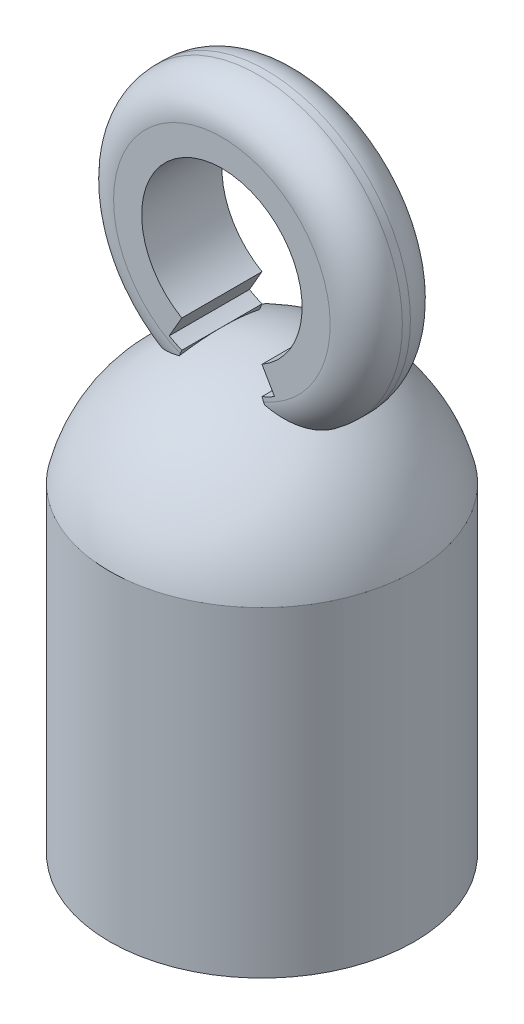
ISO-10303-21;
HEADER;
FILE_DESCRIPTION(('STEP AP214'),'2;1');
FILE_NAME('part.step','',(''),(''),'','','');
FILE_SCHEMA(('AUTOMOTIVE_DESIGN { 1 0 10303 214 1 1 1 1 }'));
ENDSEC;
DATA;
#1=APPLICATION_CONTEXT('core data for automotive mechanical design processes');
#2=APPLICATION_PROTOCOL_DEFINITION('international standard','automotive_design',2000,#1);
#3=PRODUCT_CONTEXT('',#1,'mechanical');
#4=PRODUCT('Part','Part','',(#3));
#5=PRODUCT_RELATED_PRODUCT_CATEGORY('part','',(#4));
#6=PRODUCT_DEFINITION_FORMATION('','',#4);
#7=PRODUCT_DEFINITION_CONTEXT('part definition',#1,'design');
#8=PRODUCT_DEFINITION('design','',#6,#7);
#9=PRODUCT_DEFINITION_SHAPE('','',#8);
#10=(LENGTH_UNIT() NAMED_UNIT(*) SI_UNIT(.MILLI.,.METRE.));
#11=(NAMED_UNIT(*) PLANE_ANGLE_UNIT() SI_UNIT($,.RADIAN.));
#12=(NAMED_UNIT(*) SI_UNIT($,.STERADIAN.) SOLID_ANGLE_UNIT());
#13=UNCERTAINTY_MEASURE_WITH_UNIT(LENGTH_MEASURE(1.E-05),#10,'distance_accuracy_value','');
#14=(GEOMETRIC_REPRESENTATION_CONTEXT(3) GLOBAL_UNCERTAINTY_ASSIGNED_CONTEXT((#13)) GLOBAL_UNIT_ASSIGNED_CONTEXT((#10,
#11,#12)) REPRESENTATION_CONTEXT('',''));
#15=CARTESIAN_POINT('',(0.,0.,0.));
#16=DIRECTION('',(0.,0.,1.));
#17=DIRECTION('',(1.,0.,0.));
#18=AXIS2_PLACEMENT_3D('',#15,#16,#17);
#19=CARTESIAN_POINT('',(0.,80.,0.));
#20=DIRECTION('',(0.,-1.,0.));
#21=DIRECTION('',(0.,0.,-1.));
#22=AXIS2_PLACEMENT_3D('',#19,#20,#21);
#23=CYLINDRICAL_SURFACE('',#22,38.);
#24=CARTESIAN_POINT('',(0.,80.,0.));
#25=DIRECTION('',(0.,1.,0.));
#26=DIRECTION('',(0.,0.,1.));
#27=AXIS2_PLACEMENT_3D('',#24,#25,#26);
#28=CIRCLE('',#27,38.);
#29=CARTESIAN_POINT('',(0.,80.,38.));
#30=VERTEX_POINT('',#29);
#31=EDGE_CURVE('E258',#30,#30,#28,.T.);
#32=ORIENTED_EDGE('',*,*,#31,.F.);
#33=EDGE_LOOP('',(#32));
#34=FACE_BOUND('',#33,.T.);
#35=CARTESIAN_POINT('',(0.,0.,0.));
#36=DIRECTION('',(0.,1.,0.));
#37=DIRECTION('',(0.,0.,1.));
#38=AXIS2_PLACEMENT_3D('',#35,#36,#37);
#39=CIRCLE('',#38,38.);
#40=CARTESIAN_POINT('',(0.,0.,38.));
#41=VERTEX_POINT('',#40);
#42=EDGE_CURVE('E253',#41,#41,#39,.T.);
#43=ORIENTED_EDGE('',*,*,#42,.T.);
#44=EDGE_LOOP('',(#43));
#45=FACE_BOUND('',#44,.T.);
#46=ADVANCED_FACE('F83',(#34,#45),#23,.T.);
#47=CARTESIAN_POINT('',(0.,70.9333333333333,0.));
#48=DIRECTION('',(0.,0.,1.));
#49=DIRECTION('',(1.,0.,0.));
#50=AXIS2_PLACEMENT_3D('',#47,#48,#49);
#51=SPHERICAL_SURFACE('',#50,39.0666666666667);
#52=CARTESIAN_POINT('',(-21.9284457028927,80.0701857095387,0.));
#53=DIRECTION('',(0.923076923076923,-0.384615384615386,0.));
#54=DIRECTION('',(0.384615384615386,0.923076923076923,0.));
#55=AXIS2_PLACEMENT_3D('',#52,#53,#54);
#56=CIRCLE('',#55,31.0139588275209);
#57=CARTESIAN_POINT('',(-10.6340204933393,107.176806212467,9.97660895551203));
#58=VERTEX_POINT('',#57);
#59=CARTESIAN_POINT('',(-10.0000000000001,108.698455396481,0.));
#60=VERTEX_POINT('',#59);
#61=EDGE_CURVE('E294',#58,#60,#56,.F.);
#62=ORIENTED_EDGE('',*,*,#61,.F.);
#63=CARTESIAN_POINT('',(-10.6340204933393,107.176806212467,9.97660895551203));
#64=CARTESIAN_POINT('',(-10.9967862438685,107.075012641399,9.95977995552082));
#65=CARTESIAN_POINT('',(-11.3584890454471,106.970301555475,9.93320798637625));
#66=CARTESIAN_POINT('',(-12.0788179585802,106.756238149302,9.85742275019991));
#67=CARTESIAN_POINT('',(-12.4374373106849,106.646877765958,9.80816856034925));
#68=CARTESIAN_POINT('',(-13.152519686238,106.424092353839,9.68334396158272));
#69=CARTESIAN_POINT('',(-13.5089344127348,106.310639640014,9.60754116374557));
#70=CARTESIAN_POINT('',(-14.2137051001449,106.082345913261,9.42693757116779));
#71=CARTESIAN_POINT('',(-14.5620665470673,105.96750593173,9.32215718731323));
#72=CARTESIAN_POINT('',(-15.1751061737104,105.762597520496,9.10676201848693));
#73=CARTESIAN_POINT('',(-15.4418520932187,105.672445000044,9.0021062056229));
#74=CARTESIAN_POINT('',(-15.9668300635496,105.493434524665,8.77235750580321));
#75=CARTESIAN_POINT('',(-16.2250637854138,105.404576317584,8.64726865914785));
#76=CARTESIAN_POINT('',(-16.7304268209875,105.229468396684,8.37627778965075));
#77=CARTESIAN_POINT('',(-16.9775823262028,105.143212707194,8.23042867866865));
#78=CARTESIAN_POINT('',(-17.4592547772297,104.974263137932,7.9172979284725));
#79=CARTESIAN_POINT('',(-17.6937719810923,104.891569185444,7.75001672709813));
#80=CARTESIAN_POINT('',(-18.1502449035558,104.730113555947,7.39204517791535));
#81=CARTESIAN_POINT('',(-18.3720341968576,104.651405098515,7.20111771262589));
#82=CARTESIAN_POINT('',(-18.7975070307496,104.50027398765,6.79781390634399));
#83=CARTESIAN_POINT('',(-19.0011937356424,104.427850235713,6.5854413278409));
#84=CARTESIAN_POINT('',(-19.3878046565745,104.29061601317,6.14010278056936));
#85=CARTESIAN_POINT('',(-19.57072050442,104.225808610686,5.90712857855121));
#86=CARTESIAN_POINT('',(-19.9128734382014,104.105201227879,5.42224359931389));
#87=CARTESIAN_POINT('',(-20.0721165447357,104.049398957006,5.17033766155278));
#88=CARTESIAN_POINT('',(-20.3429964096043,103.955440334521,4.6876781894133));
#89=CARTESIAN_POINT('',(-20.458188775218,103.915897737798,4.45918405249552));
#90=CARTESIAN_POINT('',(-20.667826588557,103.845015519018,3.99166823909234));
#91=CARTESIAN_POINT('',(-20.7622763136125,103.813674205523,3.75264874526298));
#92=CARTESIAN_POINT('',(-20.9289234317993,103.759855514248,3.26659548387099));
#93=CARTESIAN_POINT('',(-21.0011690678456,103.737358889433,3.01958039870203));
#94=CARTESIAN_POINT('',(-21.1225725212385,103.701616975258,2.519412187099));
#95=CARTESIAN_POINT('',(-21.1717455245238,103.68836559806,2.26626321359437));
#96=CARTESIAN_POINT('',(-21.233502983989,103.674319007151,1.84373814447544));
#97=CARTESIAN_POINT('',(-21.2528520820735,103.670810429103,1.67540831317319));
#98=CARTESIAN_POINT('',(-21.2811430802452,103.66795617748,1.33808845793413));
#99=CARTESIAN_POINT('',(-21.2901000708777,103.668604458704,1.16909974971796));
#100=CARTESIAN_POINT('',(-21.2938240823766,103.671346412829,1.));
#101=B_SPLINE_CURVE_WITH_KNOTS('',3,(#63,#64,#65,#66,#67,#68,#69,#70,#71,#72,#73,#74,#75,#76,
#77,#78,#79,#80,#81,#82,#83,#84,#85,#86,#87,#88,#89,#90,#91,#92,#93,#94,#95,#96,#97,#98,#99,
#100),.UNSPECIFIED.,.F.,.F.,(4,2,2,2,2,2,2,2,2,2,2,2,2,2,2,2,2,2,4),(0.,1.13162243665539,
2.26529457167079,3.4091489168924,4.55219961073826,5.45263194193229,6.35288644231638,
7.25088622853303,8.14886767228946,9.05672044431406,9.96441421176617,10.8724723844184,
11.7802992175243,12.5559648518875,13.3314703861035,14.1052788664847,14.8785773249185,
15.3866547351806,15.8939934310404),.UNSPECIFIED.);
#102=CARTESIAN_POINT('',(-21.2938240823766,103.671346412829,1.));
#103=VERTEX_POINT('',#102);
#104=EDGE_CURVE('E97',#58,#103,#101,.T.);
#105=ORIENTED_EDGE('',*,*,#104,.T.);
#106=CARTESIAN_POINT('',(-20.1558115123329,102.869890860464,10.0002));
#107=CARTESIAN_POINT('',(-20.2736400368171,102.949535847892,9.50838394796362));
#108=CARTESIAN_POINT('',(-20.3820436538494,103.023778884588,9.01345035291414));
#109=CARTESIAN_POINT('',(-20.5803739732907,103.160968106451,8.01836292092795));
#110=CARTESIAN_POINT('',(-20.6703014492672,103.223914764566,7.51820930346723));
#111=CARTESIAN_POINT('',(-20.832064869141,103.338026920175,6.51363868919631));
#112=CARTESIAN_POINT('',(-20.9039002141762,103.389192027686,6.00922155183165));
#113=CARTESIAN_POINT('',(-21.0297668744923,103.479370381805,4.99708991593238));
#114=CARTESIAN_POINT('',(-21.0837981268089,103.518383585438,4.48937540574305));
#115=CARTESIAN_POINT('',(-21.1732500136537,103.583228215046,3.48318563403566));
#116=CARTESIAN_POINT('',(-21.2090667573398,103.609339816428,2.98476354001172));
#117=CARTESIAN_POINT('',(-21.2640562168268,103.649512659959,1.98651774628175));
#118=CARTESIAN_POINT('',(-21.2832289077791,103.663573884119,1.48669404448432));
#119=CARTESIAN_POINT('',(-21.3050048895635,103.679548556826,0.486592314367823));
#120=CARTESIAN_POINT('',(-21.3076115915717,103.681464506261,-0.013685599201563));
#121=CARTESIAN_POINT('',(-21.2962757298195,103.673144599838,-1.01391253847238));
#122=CARTESIAN_POINT('',(-21.2823341135052,103.662909439671,-1.51386158136309));
#123=CARTESIAN_POINT('',(-21.2302373083216,103.624781615842,-2.68349994394809));
#124=CARTESIAN_POINT('',(-21.1854307928935,103.592046540089,-3.35275322548209));
#125=CARTESIAN_POINT('',(-21.0656102724274,103.505211347234,-4.68697784381051));
#126=CARTESIAN_POINT('',(-20.990603016039,103.451116003344,-5.35195010353498));
#127=CARTESIAN_POINT('',(-20.8084229624575,103.321214350187,-6.68607851759129));
#128=CARTESIAN_POINT('',(-20.7007660472081,103.245082118821,-7.35513778544349));
#129=CARTESIAN_POINT('',(-20.5149082425511,103.11561941296,-8.3522289964569));
#130=CARTESIAN_POINT('',(-20.4488776588868,103.069910267777,-8.6835765148358));
#131=CARTESIAN_POINT('',(-20.3085650110439,102.973560296285,-9.34380505606331));
#132=CARTESIAN_POINT('',(-20.2342827760118,102.922919367863,-9.67268602769062));
#133=CARTESIAN_POINT('',(-20.1558115123331,102.869890860464,-10.0002));
#134=B_SPLINE_CURVE_WITH_KNOTS('',3,(#106,#107,#108,#109,#110,#111,#112,#113,#114,#115,#116,
#117,#118,#119,#120,#121,#122,#123,#124,#125,#126,#127,#128,#129,#130,#131,#132,#133),
.UNSPECIFIED.,.F.,.F.,(4,2,2,2,2,2,2,2,2,2,2,2,2,4),(0.,1.53575441774131,3.07144452270467,
4.60718545341252,6.14293181522776,7.64367507920428,9.14442058369331,10.6448570530221,
12.1452076215383,14.1587754004143,16.1718934774647,18.2164559802332,19.2391533190631,
20.2618718371557),.UNSPECIFIED.);
#135=CARTESIAN_POINT('',(-21.2938240823766,103.671346412829,-0.999999999999999));
#136=VERTEX_POINT('',#135);
#137=EDGE_CURVE('E287',#103,#136,#134,.T.);
#138=ORIENTED_EDGE('',*,*,#137,.T.);
#139=CARTESIAN_POINT('',(-21.2938240823766,103.671346412829,-1.));
#140=CARTESIAN_POINT('',(-21.2889047706708,103.667691832027,-1.22459970082557));
#141=CARTESIAN_POINT('',(-21.2747089921182,103.667750747968,-1.44903687770988));
#142=CARTESIAN_POINT('',(-21.2281261942383,103.675161074152,-1.89582479452898));
#143=CARTESIAN_POINT('',(-21.1957449566272,103.682510167194,-2.11817617477054));
#144=CARTESIAN_POINT('',(-21.1133197871765,103.704319101359,-2.55826600945968));
#145=CARTESIAN_POINT('',(-21.0633492990044,103.718749471971,-2.77601971405687));
#146=CARTESIAN_POINT('',(-20.9463117040777,103.754455640125,-3.20631038714987));
#147=CARTESIAN_POINT('',(-20.8792438772838,103.775731725978,-3.41884713552475));
#148=CARTESIAN_POINT('',(-20.7288360197442,103.824774150702,-3.83703653388076));
#149=CARTESIAN_POINT('',(-20.6455137223876,103.852533422963,-4.04269640255052));
#150=CARTESIAN_POINT('',(-20.463389922132,103.91416824561,-4.44619078532828));
#151=CARTESIAN_POINT('',(-20.3645816544429,103.94804646995,-4.64402183201753));
#152=CARTESIAN_POINT('',(-20.1524450519681,104.021472049956,-5.03075473031557));
#153=CARTESIAN_POINT('',(-20.0391096773445,104.061022155329,-5.21965219154649));
#154=CARTESIAN_POINT('',(-19.7990091673571,104.145281324082,-5.58750526354216));
#155=CARTESIAN_POINT('',(-19.6722428226264,104.189990852065,-5.76645997681528));
#156=CARTESIAN_POINT('',(-19.4001219726176,104.286255191557,-6.12185921529104));
#157=CARTESIAN_POINT('',(-19.2541728829761,104.338033351421,-6.29778763538573));
#158=CARTESIAN_POINT('',(-18.9500634215793,104.446034008373,-6.63726515311431));
#159=CARTESIAN_POINT('',(-18.7919029681685,104.502256535179,-6.80081416795464));
#160=CARTESIAN_POINT('',(-18.4647048512664,104.618493894288,-7.11504617301188));
#161=CARTESIAN_POINT('',(-18.2956708905531,104.678507435505,-7.26573350279692));
#162=CARTESIAN_POINT('',(-17.9479094413458,104.801722670225,-7.55407424181917));
#163=CARTESIAN_POINT('',(-17.7691801944761,104.864924941903,-7.69172527422745));
#164=CARTESIAN_POINT('',(-17.3318950994583,105.019044988795,-8.00499554683038));
#165=CARTESIAN_POINT('',(-17.0693698151592,105.111166634404,-8.17451104429511));
#166=CARTESIAN_POINT('',(-16.5308628313434,105.298826602881,-8.48845767596165));
#167=CARTESIAN_POINT('',(-16.2548765693244,105.394366081231,-8.63288022834921));
#168=CARTESIAN_POINT('',(-15.6911315995032,105.587741882267,-8.89783896943634));
#169=CARTESIAN_POINT('',(-15.4033333210024,105.685585361151,-9.01828533733228));
#170=CARTESIAN_POINT('',(-14.8192298392296,105.881895022157,-9.23578327937108));
#171=CARTESIAN_POINT('',(-14.5229231775361,105.980361308751,-9.33283081560812));
#172=CARTESIAN_POINT('',(-13.9314151412388,106.174200019225,-9.50278280048595));
#173=CARTESIAN_POINT('',(-13.6363747608992,106.269587786252,-9.57623497259377));
#174=CARTESIAN_POINT('',(-13.0416057919008,106.458786870901,-9.70384469759392));
#175=CARTESIAN_POINT('',(-12.7418760864866,106.552597801618,-9.75799757906593));
#176=CARTESIAN_POINT('',(-12.1419829656353,106.736794886702,-9.84826554893291));
#177=CARTESIAN_POINT('',(-11.8418522440958,106.82720550766,-9.88455128261057));
#178=CARTESIAN_POINT('',(-11.2394148013789,107.004685303199,-9.94167889968597));
#179=CARTESIAN_POINT('',(-10.937110207954,107.091757325211,-9.96253423430179));
#180=CARTESIAN_POINT('',(-10.6340204933393,107.176806212467,-9.97660895551203));
#181=B_SPLINE_CURVE_WITH_KNOTS('',3,(#139,#140,#141,#142,#143,#144,#145,#146,#147,#148,#149,
#150,#151,#152,#153,#154,#155,#156,#157,#158,#159,#160,#161,#162,#163,#164,#165,#166,#167,#168,
#169,#170,#171,#172,#173,#174,#175,#176,#177,#178,#179,#180),.UNSPECIFIED.,.F.,.F.,(4,2,2,2,2,2,
2,2,2,2,2,2,2,2,2,2,2,2,2,2,4),(0.,0.673802349464596,1.34739059763043,2.01819901445322,
2.68903568645439,3.35914453769739,4.02954693502443,4.7002754464699,5.37106440382869,
6.07347799776906,6.77589628904288,7.47807663778432,8.18038476532462,9.15633605381641,
10.1326204644946,11.1124961601096,12.0925408307594,13.0478401692839,14.0033705825535,
14.9495888107279,15.8949812124056),.UNSPECIFIED.);
#182=CARTESIAN_POINT('',(-10.6340204933393,107.176806212467,-9.97660895551203));
#183=VERTEX_POINT('',#182);
#184=EDGE_CURVE('E311',#136,#183,#181,.T.);
#185=ORIENTED_EDGE('',*,*,#184,.T.);
#186=EDGE_CURVE('E271',#60,#183,#56,.F.);
#187=ORIENTED_EDGE('',*,*,#186,.F.);
#188=EDGE_LOOP('',(#62,#105,#138,#185,#187));
#189=FACE_BOUND('',#188,.T.);
#190=CARTESIAN_POINT('',(21.9284457028927,80.0701857095386,0.));
#191=DIRECTION('',(-0.923076923076923,-0.384615384615385,0.));
#192=DIRECTION('',(0.384615384615385,-0.923076923076923,0.));
#193=AXIS2_PLACEMENT_3D('',#190,#191,#192);
#194=CIRCLE('',#193,31.0139588275209);
#195=CARTESIAN_POINT('',(10.,108.698455396481,0.));
#196=VERTEX_POINT('',#195);
#197=CARTESIAN_POINT('',(10.6340204933393,107.176806212467,9.97660895551204));
#198=VERTEX_POINT('',#197);
#199=EDGE_CURVE('E264',#196,#198,#194,.F.);
#200=ORIENTED_EDGE('',*,*,#199,.F.);
#201=CARTESIAN_POINT('',(10.6340204933393,107.176806212467,-9.97660895551205));
#202=VERTEX_POINT('',#201);
#203=EDGE_CURVE('E261',#202,#196,#194,.F.);
#204=ORIENTED_EDGE('',*,*,#203,.F.);
#205=CARTESIAN_POINT('',(10.6340204933393,107.176806212467,-9.97660895551205));
#206=CARTESIAN_POINT('',(10.9967862438684,107.075012641399,-9.95977995552082));
#207=CARTESIAN_POINT('',(11.3584890454471,106.970301555475,-9.93320798637625));
#208=CARTESIAN_POINT('',(12.0788179585801,106.756238149302,-9.85742275019991));
#209=CARTESIAN_POINT('',(12.4374373106849,106.646877765958,-9.80816856034926));
#210=CARTESIAN_POINT('',(13.152519686238,106.424092353839,-9.68334396158273));
#211=CARTESIAN_POINT('',(13.5089344127347,106.310639640014,-9.60754116374557));
#212=CARTESIAN_POINT('',(14.2137051001448,106.082345913261,-9.4269375711678));
#213=CARTESIAN_POINT('',(14.5620665470672,105.96750593173,-9.32215718731324));
#214=CARTESIAN_POINT('',(15.1751061737104,105.762597520496,-9.10676201848695));
#215=CARTESIAN_POINT('',(15.4418520932187,105.672445000044,-9.00210620562291));
#216=CARTESIAN_POINT('',(15.9668300635496,105.493434524665,-8.77235750580322));
#217=CARTESIAN_POINT('',(16.2250637854137,105.404576317584,-8.64726865914786));
#218=CARTESIAN_POINT('',(16.7304268209875,105.229468396684,-8.37627778965076));
#219=CARTESIAN_POINT('',(16.9775823262027,105.143212707194,-8.23042867866866));
#220=CARTESIAN_POINT('',(17.4592547772297,104.974263137932,-7.91729792847251));
#221=CARTESIAN_POINT('',(17.6937719810922,104.891569185444,-7.75001672709815));
#222=CARTESIAN_POINT('',(18.1502449035558,104.730113555947,-7.39204517791538));
#223=CARTESIAN_POINT('',(18.3720341968576,104.651405098515,-7.20111771262591));
#224=CARTESIAN_POINT('',(18.7975070307495,104.50027398765,-6.79781390634401));
#225=CARTESIAN_POINT('',(19.0011937356424,104.427850235713,-6.58544132784092));
#226=CARTESIAN_POINT('',(19.3878046565744,104.29061601317,-6.14010278056938));
#227=CARTESIAN_POINT('',(19.57072050442,104.225808610686,-5.90712857855123));
#228=CARTESIAN_POINT('',(19.9128734382014,104.105201227879,-5.42224359931391));
#229=CARTESIAN_POINT('',(20.0721165447357,104.049398957006,-5.1703376615528));
#230=CARTESIAN_POINT('',(20.3429964096042,103.955440334521,-4.68767818941332));
#231=CARTESIAN_POINT('',(20.458188775218,103.915897737798,-4.45918405249554));
#232=CARTESIAN_POINT('',(20.667826588557,103.845015519018,-3.99166823909236));
#233=CARTESIAN_POINT('',(20.7622763136125,103.813674205523,-3.752648745263));
#234=CARTESIAN_POINT('',(20.9289234317993,103.759855514248,-3.26659548387101));
#235=CARTESIAN_POINT('',(21.0011690678456,103.737358889433,-3.01958039870205));
#236=CARTESIAN_POINT('',(21.1225725212384,103.701616975258,-2.51941218709903));
#237=CARTESIAN_POINT('',(21.1717455245238,103.68836559806,-2.26626321359439));
#238=CARTESIAN_POINT('',(21.233502983989,103.674319007151,-1.84373814447546));
#239=CARTESIAN_POINT('',(21.2528520820735,103.670810429103,-1.67540831317321));
#240=CARTESIAN_POINT('',(21.2811430802451,103.66795617748,-1.33808845793413));
#241=CARTESIAN_POINT('',(21.2901000708777,103.668604458704,-1.16909974971796));
#242=CARTESIAN_POINT('',(21.2938240823766,103.671346412829,-1.));
#243=B_SPLINE_CURVE_WITH_KNOTS('',3,(#205,#206,#207,#208,#209,#210,#211,#212,#213,#214,#215,
#216,#217,#218,#219,#220,#221,#222,#223,#224,#225,#226,#227,#228,#229,#230,#231,#232,#233,#234,
#235,#236,#237,#238,#239,#240,#241,#242),.UNSPECIFIED.,.F.,.F.,(4,2,2,2,2,2,2,2,2,2,2,2,2,2,2,2,
2,2,4),(0.,1.13162243665539,2.26529457167079,3.4091489168924,4.55219961073825,5.45263194193228,
6.35288644231638,7.25088622853303,8.14886767228946,9.05672044431406,9.96441421176616,
10.8724723844184,11.7802992175243,12.5559648518875,13.3314703861035,14.1052788664847,
14.8785773249185,15.3866547351806,15.8939934310404),.UNSPECIFIED.);
#244=CARTESIAN_POINT('',(21.2938240823766,103.671346412829,-1.));
#245=VERTEX_POINT('',#244);
#246=EDGE_CURVE('E317',#202,#245,#243,.T.);
#247=ORIENTED_EDGE('',*,*,#246,.T.);
#248=CARTESIAN_POINT('',(20.1558115123329,102.869890860464,-10.0002));
#249=CARTESIAN_POINT('',(20.273640036817,102.949535847892,-9.50838394796362));
#250=CARTESIAN_POINT('',(20.3820436538494,103.023778884588,-9.01345035291414));
#251=CARTESIAN_POINT('',(20.5803739732907,103.160968106451,-8.01836292092795));
#252=CARTESIAN_POINT('',(20.6703014492671,103.223914764566,-7.51820930346723));
#253=CARTESIAN_POINT('',(20.832064869141,103.338026920175,-6.51363868919631));
#254=CARTESIAN_POINT('',(20.9039002141762,103.389192027686,-6.00922155183165));
#255=CARTESIAN_POINT('',(21.0297668744923,103.479370381805,-4.99708991593238));
#256=CARTESIAN_POINT('',(21.0837981268088,103.518383585438,-4.48937540574305));
#257=CARTESIAN_POINT('',(21.1732500136537,103.583228215046,-3.48318563403566));
#258=CARTESIAN_POINT('',(21.2090667573398,103.609339816428,-2.98476354001172));
#259=CARTESIAN_POINT('',(21.2640562168268,103.649512659959,-1.98651774628175));
#260=CARTESIAN_POINT('',(21.283228907779,103.663573884119,-1.48669404448433));
#261=CARTESIAN_POINT('',(21.3050048895635,103.679548556826,-0.486592314367824));
#262=CARTESIAN_POINT('',(21.3076115915717,103.681464506261,0.0136855992015615));
#263=CARTESIAN_POINT('',(21.2962757298195,103.673144599838,1.01391253847238));
#264=CARTESIAN_POINT('',(21.2823341135052,103.662909439671,1.51386158136309));
#265=CARTESIAN_POINT('',(21.2302373083216,103.624781615842,2.68349994394809));
#266=CARTESIAN_POINT('',(21.1854307928935,103.592046540089,3.35275322548209));
#267=CARTESIAN_POINT('',(21.0656102724274,103.505211347234,4.68697784381051));
#268=CARTESIAN_POINT('',(20.990603016039,103.451116003344,5.35195010353499));
#269=CARTESIAN_POINT('',(20.8084229624575,103.321214350187,6.68607851759129));
#270=CARTESIAN_POINT('',(20.7007660472081,103.245082118821,7.3551377854435));
#271=CARTESIAN_POINT('',(20.514908242551,103.11561941296,8.3522289964569));
#272=CARTESIAN_POINT('',(20.4488776588868,103.069910267777,8.6835765148358));
#273=CARTESIAN_POINT('',(20.3085650110438,102.973560296285,9.3438050560633));
#274=CARTESIAN_POINT('',(20.2342827760118,102.922919367864,9.67268602769062));
#275=CARTESIAN_POINT('',(20.155811512333,102.869890860464,10.0002));
#276=B_SPLINE_CURVE_WITH_KNOTS('',3,(#248,#249,#250,#251,#252,#253,#254,#255,#256,#257,#258,
#259,#260,#261,#262,#263,#264,#265,#266,#267,#268,#269,#270,#271,#272,#273,#274,#275),
.UNSPECIFIED.,.F.,.F.,(4,2,2,2,2,2,2,2,2,2,2,2,2,4),(0.,1.5357544177413,3.07144452270467,
4.60718545341253,6.14293181522776,7.64367507920428,9.14442058369331,10.6448570530221,
12.1452076215383,14.1587754004143,16.1718934774647,18.2164559802332,19.2391533190631,
20.2618718371557),.UNSPECIFIED.);
#277=CARTESIAN_POINT('',(21.2938240823766,103.671346412829,1.));
#278=VERTEX_POINT('',#277);
#279=EDGE_CURVE('E263',#245,#278,#276,.T.);
#280=ORIENTED_EDGE('',*,*,#279,.T.);
#281=CARTESIAN_POINT('',(21.2938240823766,103.671346412829,1.));
#282=CARTESIAN_POINT('',(21.2889047706708,103.667691832027,1.22459970082557));
#283=CARTESIAN_POINT('',(21.2747089921182,103.667750747968,1.44903687770988));
#284=CARTESIAN_POINT('',(21.2281261942382,103.675161074152,1.89582479452898));
#285=CARTESIAN_POINT('',(21.1957449566272,103.682510167194,2.11817617477054));
#286=CARTESIAN_POINT('',(21.1133197871765,103.704319101359,2.55826600945968));
#287=CARTESIAN_POINT('',(21.0633492990043,103.718749471971,2.77601971405687));
#288=CARTESIAN_POINT('',(20.9463117040777,103.754455640125,3.20631038714987));
#289=CARTESIAN_POINT('',(20.8792438772838,103.775731725978,3.41884713552475));
#290=CARTESIAN_POINT('',(20.7288360197442,103.824774150702,3.83703653388076));
#291=CARTESIAN_POINT('',(20.6455137223876,103.852533422963,4.04269640255052));
#292=CARTESIAN_POINT('',(20.463389922132,103.91416824561,4.44619078532828));
#293=CARTESIAN_POINT('',(20.3645816544428,103.94804646995,4.64402183201753));
#294=CARTESIAN_POINT('',(20.1524450519681,104.021472049956,5.03075473031556));
#295=CARTESIAN_POINT('',(20.0391096773445,104.061022155329,5.21965219154649));
#296=CARTESIAN_POINT('',(19.799009167357,104.145281324082,5.58750526354216));
#297=CARTESIAN_POINT('',(19.6722428226264,104.189990852065,5.76645997681528));
#298=CARTESIAN_POINT('',(19.4001219726176,104.286255191557,6.12185921529104));
#299=CARTESIAN_POINT('',(19.2541728829761,104.338033351421,6.29778763538573));
#300=CARTESIAN_POINT('',(18.9500634215793,104.446034008373,6.63726515311431));
#301=CARTESIAN_POINT('',(18.7919029681685,104.502256535179,6.80081416795463));
#302=CARTESIAN_POINT('',(18.4647048512664,104.618493894288,7.11504617301188));
#303=CARTESIAN_POINT('',(18.2956708905531,104.678507435505,7.26573350279692));
#304=CARTESIAN_POINT('',(17.9479094413458,104.801722670225,7.55407424181917));
#305=CARTESIAN_POINT('',(17.7691801944761,104.864924941903,7.69172527422745));
#306=CARTESIAN_POINT('',(17.3318950994582,105.019044988795,8.00499554683038));
#307=CARTESIAN_POINT('',(17.0693698151592,105.111166634404,8.17451104429511));
#308=CARTESIAN_POINT('',(16.5308628313434,105.298826602881,8.48845767596165));
#309=CARTESIAN_POINT('',(16.2548765693244,105.394366081231,8.63288022834921));
#310=CARTESIAN_POINT('',(15.6911315995032,105.587741882267,8.89783896943634));
#311=CARTESIAN_POINT('',(15.4033333210024,105.685585361152,9.01828533733228));
#312=CARTESIAN_POINT('',(14.8192298392296,105.881895022157,9.23578327937108));
#313=CARTESIAN_POINT('',(14.522923177536,105.980361308751,9.33283081560812));
#314=CARTESIAN_POINT('',(13.9314151412388,106.174200019225,9.50278280048595));
#315=CARTESIAN_POINT('',(13.6363747608992,106.269587786252,9.57623497259377));
#316=CARTESIAN_POINT('',(13.0416057919007,106.458786870901,9.70384469759393));
#317=CARTESIAN_POINT('',(12.7418760864866,106.552597801618,9.75799757906593));
#318=CARTESIAN_POINT('',(12.1419829656352,106.736794886702,9.84826554893291));
#319=CARTESIAN_POINT('',(11.8418522440958,106.82720550766,9.88455128261057));
#320=CARTESIAN_POINT('',(11.2394148013789,107.004685303199,9.94167889968597));
#321=CARTESIAN_POINT('',(10.9371102079539,107.091757325211,9.9625342343018));
#322=CARTESIAN_POINT('',(10.6340204933393,107.176806212467,9.97660895551203));
#323=B_SPLINE_CURVE_WITH_KNOTS('',3,(#281,#282,#283,#284,#285,#286,#287,#288,#289,#290,#291,
#292,#293,#294,#295,#296,#297,#298,#299,#300,#301,#302,#303,#304,#305,#306,#307,#308,#309,#310,
#311,#312,#313,#314,#315,#316,#317,#318,#319,#320,#321,#322),.UNSPECIFIED.,.F.,.F.,(4,2,2,2,2,2,
2,2,2,2,2,2,2,2,2,2,2,2,2,2,4),(0.,0.673802349464594,1.34739059763043,2.01819901445322,
2.68903568645439,3.35914453769739,4.02954693502442,4.70027544646989,5.37106440382869,
6.07347799776906,6.77589628904288,7.47807663778432,8.18038476532462,9.15633605381641,
10.1326204644946,11.1124961601096,12.0925408307594,13.0478401692839,14.0033705825535,
14.9495888107279,15.8949812124056),.UNSPECIFIED.);
#324=EDGE_CURVE('E12',#278,#198,#323,.T.);
#325=ORIENTED_EDGE('',*,*,#324,.T.);
#326=EDGE_LOOP('',(#200,#204,#247,#280,#325));
#327=FACE_BOUND('',#326,.T.);
#328=ORIENTED_EDGE('',*,*,#31,.T.);
#329=EDGE_LOOP('',(#328));
#330=FACE_BOUND('',#329,.T.);
#331=ADVANCED_FACE('F273',(#189,#327,#330),#51,.T.);
#332=CARTESIAN_POINT('',(0.,0.,0.));
#333=DIRECTION('',(0.,1.,0.));
#334=DIRECTION('',(0.,0.,1.));
#335=AXIS2_PLACEMENT_3D('',#332,#333,#334);
#336=PLANE('',#335);
#337=CARTESIAN_POINT('',(0.,0.,0.));
#338=DIRECTION('',(0.,-1.,0.));
#339=DIRECTION('',(0.,0.,-1.));
#340=AXIS2_PLACEMENT_3D('',#337,#338,#339);
#341=CIRCLE('',#340,29.);
#342=CARTESIAN_POINT('',(0.,0.,-29.));
#343=VERTEX_POINT('',#342);
#344=EDGE_CURVE('E248',#343,#343,#341,.T.);
#345=ORIENTED_EDGE('',*,*,#344,.F.);
#346=EDGE_LOOP('',(#345));
#347=FACE_BOUND('',#346,.T.);
#348=ORIENTED_EDGE('',*,*,#42,.F.);
#349=EDGE_LOOP('',(#348));
#350=FACE_BOUND('',#349,.T.);
#351=ADVANCED_FACE('F341',(#347,#350),#336,.F.);
#352=CARTESIAN_POINT('',(0.,75.,0.));
#353=DIRECTION('',(0.,-1.,0.));
#354=DIRECTION('',(0.,0.,-1.));
#355=AXIS2_PLACEMENT_3D('',#352,#353,#354);
#356=CYLINDRICAL_SURFACE('',#355,29.);
#357=CARTESIAN_POINT('',(0.,75.,0.));
#358=DIRECTION('',(0.,-1.,0.));
#359=DIRECTION('',(0.,0.,-1.));
#360=AXIS2_PLACEMENT_3D('',#357,#358,#359);
#361=CIRCLE('',#360,29.);
#362=CARTESIAN_POINT('',(0.,75.,-29.));
#363=VERTEX_POINT('',#362);
#364=EDGE_CURVE('E250',#363,#363,#361,.T.);
#365=ORIENTED_EDGE('',*,*,#364,.F.);
#366=EDGE_LOOP('',(#365));
#367=FACE_BOUND('',#366,.T.);
#368=ORIENTED_EDGE('',*,*,#344,.T.);
#369=EDGE_LOOP('',(#368));
#370=FACE_BOUND('',#369,.T.);
#371=ADVANCED_FACE('F348',(#367,#370),#356,.F.);
#372=CARTESIAN_POINT('',(0.,75.,0.));
#373=DIRECTION('',(0.,-1.,0.));
#374=DIRECTION('',(0.,0.,-1.));
#375=AXIS2_PLACEMENT_3D('',#372,#373,#374);
#376=PLANE('',#375);
#377=ORIENTED_EDGE('',*,*,#364,.T.);
#378=EDGE_LOOP('',(#377));
#379=FACE_BOUND('',#378,.T.);
#380=ADVANCED_FACE('F352',(#379),#376,.T.);
#381=CARTESIAN_POINT('',(-10.,108.698455396481,10.));
#382=DIRECTION('',(0.923076923076923,-0.384615384615386,0.));
#383=DIRECTION('',(0.384615384615386,0.923076923076923,0.));
#384=AXIS2_PLACEMENT_3D('',#381,#382,#383);
#385=PLANE('',#384);
#386=ORIENTED_EDGE('',*,*,#186,.T.);
#387=CARTESIAN_POINT('',(-10.3846153846154,107.775378473404,-1.));
#388=DIRECTION('',(0.923076923076923,-0.384615384615386,0.));
#389=DIRECTION('',(0.384615384615386,0.923076923076923,0.));
#390=AXIS2_PLACEMENT_3D('',#387,#388,#389);
#391=CIRCLE('',#390,9.);
#392=CARTESIAN_POINT('',(-10.3846153846154,107.775378473404,-10.));
#393=VERTEX_POINT('',#392);
#394=EDGE_CURVE('E210',#183,#393,#391,.T.);
#395=ORIENTED_EDGE('',*,*,#394,.T.);
#396=DIRECTION('',(-0.384615384615386,-0.923076923076923,0.));
#397=VECTOR('',#396,1.);
#398=CARTESIAN_POINT('',(-10.,108.698455396481,-10.));
#399=LINE('',#398,#397);
#400=CARTESIAN_POINT('',(-10.,108.698455396481,-10.));
#401=VERTEX_POINT('',#400);
#402=EDGE_CURVE('E201',#401,#393,#399,.T.);
#403=ORIENTED_EDGE('',*,*,#402,.F.);
#404=DIRECTION('',(0.,0.,-1.));
#405=VECTOR('',#404,1.);
#406=CARTESIAN_POINT('',(-10.,108.698455396481,10.));
#407=LINE('',#406,#405);
#408=EDGE_CURVE('E185',#60,#401,#407,.T.);
#409=ORIENTED_EDGE('',*,*,#408,.F.);
#410=EDGE_LOOP('',(#386,#395,#403,#409));
#411=FACE_BOUND('',#410,.T.);
#412=ADVANCED_FACE('F208',(#411),#385,.T.);
#413=CARTESIAN_POINT('',(13.8461538461539,99.4676861657118,10.));
#414=DIRECTION('',(-0.923076923076923,-0.384615384615385,0.));
#415=DIRECTION('',(0.384615384615385,-0.923076923076923,0.));
#416=AXIS2_PLACEMENT_3D('',#413,#414,#415);
#417=PLANE('',#416);
#418=DIRECTION('',(-0.384615384615385,0.923076923076923,0.));
#419=VECTOR('',#418,1.);
#420=CARTESIAN_POINT('',(13.8461538461539,99.4676861657118,-10.));
#421=LINE('',#420,#419);
#422=CARTESIAN_POINT('',(10.3846153846154,107.775378473404,-10.));
#423=VERTEX_POINT('',#422);
#424=CARTESIAN_POINT('',(10.,108.698455396481,-10.));
#425=VERTEX_POINT('',#424);
#426=EDGE_CURVE('E214',#423,#425,#421,.T.);
#427=ORIENTED_EDGE('',*,*,#426,.F.);
#428=CARTESIAN_POINT('',(10.3846153846154,107.775378473404,-1.));
#429=DIRECTION('',(-0.923076923076923,-0.384615384615385,0.));
#430=DIRECTION('',(0.384615384615385,-0.923076923076923,0.));
#431=AXIS2_PLACEMENT_3D('',#428,#429,#430);
#432=CIRCLE('',#431,9.);
#433=EDGE_CURVE('E303',#423,#202,#432,.T.);
#434=ORIENTED_EDGE('',*,*,#433,.T.);
#435=ORIENTED_EDGE('',*,*,#203,.T.);
#436=DIRECTION('',(0.,0.,-1.));
#437=VECTOR('',#436,1.);
#438=CARTESIAN_POINT('',(10.,108.698455396481,10.));
#439=LINE('',#438,#437);
#440=EDGE_CURVE('E223',#196,#425,#439,.T.);
#441=ORIENTED_EDGE('',*,*,#440,.T.);
#442=EDGE_LOOP('',(#427,#434,#435,#441));
#443=FACE_BOUND('',#442,.T.);
#444=ADVANCED_FACE('F394',(#443),#417,.T.);
#445=CARTESIAN_POINT('',(0.,132.698455396481,10.));
#446=DIRECTION('',(0.,0.,-1.));
#447=DIRECTION('',(-1.,0.,0.));
#448=AXIS2_PLACEMENT_3D('',#445,#446,#447);
#449=CYLINDRICAL_SURFACE('',#448,26.);
#450=CARTESIAN_POINT('',(0.,132.698455396481,-10.));
#451=DIRECTION('',(0.,0.,1.));
#452=DIRECTION('',(1.,0.,0.));
#453=AXIS2_PLACEMENT_3D('',#450,#451,#452);
#454=CIRCLE('',#453,26.);
#455=CARTESIAN_POINT('',(-13.1244442085566,110.254102783485,-10.));
#456=VERTEX_POINT('',#455);
#457=EDGE_CURVE('E188',#456,#401,#454,.T.);
#458=ORIENTED_EDGE('',*,*,#457,.F.);
#459=DIRECTION('',(0.,0.,-1.));
#460=VECTOR('',#459,1.);
#461=CARTESIAN_POINT('',(-13.1244442085566,110.254102783485,10.));
#462=LINE('',#461,#460);
#463=CARTESIAN_POINT('',(-13.1244442085566,110.254102783485,10.));
#464=VERTEX_POINT('',#463);
#465=EDGE_CURVE('E226',#456,#464,#462,.F.);
#466=ORIENTED_EDGE('',*,*,#465,.T.);
#467=CARTESIAN_POINT('',(0.,132.698455396481,10.));
#468=DIRECTION('',(0.,0.,1.));
#469=DIRECTION('',(1.,0.,0.));
#470=AXIS2_PLACEMENT_3D('',#467,#468,#469);
#471=CIRCLE('',#470,26.);
#472=CARTESIAN_POINT('',(-10.,108.698455396481,10.));
#473=VERTEX_POINT('',#472);
#474=EDGE_CURVE('E218',#464,#473,#471,.T.);
#475=ORIENTED_EDGE('',*,*,#474,.T.);
#476=EDGE_CURVE('E191',#473,#60,#407,.T.);
#477=ORIENTED_EDGE('',*,*,#476,.T.);
#478=ORIENTED_EDGE('',*,*,#408,.T.);
#479=EDGE_LOOP('',(#458,#466,#475,#477,#478));
#480=FACE_BOUND('',#479,.T.);
#481=ADVANCED_FACE('F187',(#480),#449,.F.);
#482=DIRECTION('',(0.,0.,-1.));
#483=VECTOR('',#482,1.);
#484=CARTESIAN_POINT('',(13.1244442085566,110.254102783485,10.));
#485=LINE('',#484,#483);
#486=CARTESIAN_POINT('',(13.1244442085566,110.254102783485,10.));
#487=VERTEX_POINT('',#486);
#488=CARTESIAN_POINT('',(13.1244442085566,110.254102783485,-10.));
#489=VERTEX_POINT('',#488);
#490=EDGE_CURVE('E228',#487,#489,#485,.T.);
#491=ORIENTED_EDGE('',*,*,#490,.T.);
#492=EDGE_CURVE('E206',#425,#489,#454,.T.);
#493=ORIENTED_EDGE('',*,*,#492,.F.);
#494=ORIENTED_EDGE('',*,*,#440,.F.);
#495=CARTESIAN_POINT('',(10.,108.698455396481,10.));
#496=VERTEX_POINT('',#495);
#497=EDGE_CURVE('E196',#496,#196,#439,.T.);
#498=ORIENTED_EDGE('',*,*,#497,.F.);
#499=EDGE_CURVE('E219',#496,#487,#471,.T.);
#500=ORIENTED_EDGE('',*,*,#499,.T.);
#501=EDGE_LOOP('',(#491,#493,#494,#498,#500));
#502=FACE_BOUND('',#501,.T.);
#503=ADVANCED_FACE('F388',(#502),#449,.F.);
#504=CARTESIAN_POINT('',(0.,132.986306973808,10.));
#505=DIRECTION('',(0.,0.,1.));
#506=DIRECTION('',(1.,0.,0.));
#507=AXIS2_PLACEMENT_3D('',#504,#505,#506);
#508=PLANE('',#507);
#509=DIRECTION('',(-0.384615384615385,0.923076923076923,0.));
#510=VECTOR('',#509,1.);
#511=CARTESIAN_POINT('',(13.8461538461539,99.4676861657118,10.));
#512=LINE('',#511,#510);
#513=CARTESIAN_POINT('',(10.3846153846154,107.775378473404,10.));
#514=VERTEX_POINT('',#513);
#515=EDGE_CURVE('E221',#514,#496,#512,.T.);
#516=ORIENTED_EDGE('',*,*,#515,.F.);
#517=CARTESIAN_POINT('',(0.,132.698455396481,10.));
#518=DIRECTION('',(0.,0.,1.));
#519=DIRECTION('',(1.,0.,0.));
#520=AXIS2_PLACEMENT_3D('',#517,#518,#519);
#521=CIRCLE('',#520,27.);
#522=CARTESIAN_POINT('',(-10.3846153846154,107.775378473404,10.));
#523=VERTEX_POINT('',#522);
#524=EDGE_CURVE('E305',#514,#523,#521,.T.);
#525=ORIENTED_EDGE('',*,*,#524,.T.);
#526=DIRECTION('',(-0.384615384615386,-0.923076923076923,0.));
#527=VECTOR('',#526,1.);
#528=CARTESIAN_POINT('',(-10.,108.698455396481,10.));
#529=LINE('',#528,#527);
#530=EDGE_CURVE('E216',#473,#523,#529,.T.);
#531=ORIENTED_EDGE('',*,*,#530,.F.);
#532=ORIENTED_EDGE('',*,*,#474,.F.);
#533=DIRECTION('',(-0.499999999999998,-0.86602540378444,0.));
#534=VECTOR('',#533,1.);
#535=CARTESIAN_POINT('',(-10.,115.66579889812,10.));
#536=LINE('',#535,#534);
#537=CARTESIAN_POINT('',(-10.,115.66579889812,10.));
#538=VERTEX_POINT('',#537);
#539=EDGE_CURVE('E236',#538,#464,#536,.T.);
#540=ORIENTED_EDGE('',*,*,#539,.F.);
#541=CARTESIAN_POINT('',(0.,132.986306973808,10.));
#542=DIRECTION('',(0.,0.,1.));
#543=DIRECTION('',(1.,0.,0.));
#544=AXIS2_PLACEMENT_3D('',#541,#542,#543);
#545=CIRCLE('',#544,20.);
#546=CARTESIAN_POINT('',(9.99999999999998,115.66579889812,10.));
#547=VERTEX_POINT('',#546);
#548=EDGE_CURVE('E230',#538,#547,#545,.F.);
#549=ORIENTED_EDGE('',*,*,#548,.T.);
#550=DIRECTION('',(-0.5,0.866025403784438,0.));
#551=VECTOR('',#550,1.);
#552=CARTESIAN_POINT('',(15.,107.005544860275,10.));
#553=LINE('',#552,#551);
#554=EDGE_CURVE('E233',#487,#547,#553,.T.);
#555=ORIENTED_EDGE('',*,*,#554,.F.);
#556=ORIENTED_EDGE('',*,*,#499,.F.);
#557=EDGE_LOOP('',(#516,#525,#531,#532,#540,#549,#555,#556));
#558=FACE_BOUND('',#557,.T.);
#559=ADVANCED_FACE('F282',(#558),#508,.T.);
#560=CARTESIAN_POINT('',(0.,132.698455396481,10.));
#561=DIRECTION('',(0.,0.,-1.));
#562=DIRECTION('',(-1.,0.,0.));
#563=AXIS2_PLACEMENT_3D('',#560,#561,#562);
#564=CYLINDRICAL_SURFACE('',#563,36.);
#565=ORIENTED_EDGE('',*,*,#279,.F.);
#566=CARTESIAN_POINT('',(0.,132.698455396481,-1.));
#567=DIRECTION('',(0.,0.,1.));
#568=DIRECTION('',(1.,0.,0.));
#569=AXIS2_PLACEMENT_3D('',#566,#567,#568);
#570=CIRCLE('',#569,36.);
#571=EDGE_CURVE('E297',#245,#136,#570,.T.);
#572=ORIENTED_EDGE('',*,*,#571,.T.);
#573=ORIENTED_EDGE('',*,*,#137,.F.);
#574=CARTESIAN_POINT('',(0.,132.698455396481,1.));
#575=DIRECTION('',(0.,0.,1.));
#576=DIRECTION('',(1.,0.,0.));
#577=AXIS2_PLACEMENT_3D('',#574,#575,#576);
#578=CIRCLE('',#577,36.);
#579=EDGE_CURVE('E295',#103,#278,#578,.F.);
#580=ORIENTED_EDGE('',*,*,#579,.T.);
#581=EDGE_LOOP('',(#565,#572,#573,#580));
#582=FACE_BOUND('',#581,.T.);
#583=ADVANCED_FACE('F276',(#582),#564,.T.);
#584=ORIENTED_EDGE('',*,*,#530,.T.);
#585=CARTESIAN_POINT('',(-10.3846153846154,107.775378473404,1.));
#586=DIRECTION('',(0.923076923076923,-0.384615384615386,0.));
#587=DIRECTION('',(0.384615384615386,0.923076923076923,0.));
#588=AXIS2_PLACEMENT_3D('',#585,#586,#587);
#589=CIRCLE('',#588,9.);
#590=EDGE_CURVE('E110',#523,#58,#589,.T.);
#591=ORIENTED_EDGE('',*,*,#590,.T.);
#592=ORIENTED_EDGE('',*,*,#61,.T.);
#593=ORIENTED_EDGE('',*,*,#476,.F.);
#594=EDGE_LOOP('',(#584,#591,#592,#593));
#595=FACE_BOUND('',#594,.T.);
#596=ADVANCED_FACE('F281',(#595),#385,.T.);
#597=ORIENTED_EDGE('',*,*,#199,.T.);
#598=CARTESIAN_POINT('',(10.3846153846154,107.775378473404,1.));
#599=DIRECTION('',(-0.923076923076923,-0.384615384615385,0.));
#600=DIRECTION('',(0.384615384615385,-0.923076923076923,0.));
#601=AXIS2_PLACEMENT_3D('',#598,#599,#600);
#602=CIRCLE('',#601,9.);
#603=EDGE_CURVE('E309',#198,#514,#602,.T.);
#604=ORIENTED_EDGE('',*,*,#603,.T.);
#605=ORIENTED_EDGE('',*,*,#515,.T.);
#606=ORIENTED_EDGE('',*,*,#497,.T.);
#607=EDGE_LOOP('',(#597,#604,#605,#606));
#608=FACE_BOUND('',#607,.T.);
#609=ADVANCED_FACE('F361',(#608),#417,.T.);
#610=CARTESIAN_POINT('',(0.,132.986306973808,-10.));
#611=DIRECTION('',(0.,0.,1.));
#612=DIRECTION('',(1.,0.,0.));
#613=AXIS2_PLACEMENT_3D('',#610,#611,#612);
#614=CYLINDRICAL_SURFACE('',#613,20.);
#615=DIRECTION('',(0.,0.,1.));
#616=VECTOR('',#615,1.);
#617=CARTESIAN_POINT('',(9.99999999999998,115.66579889812,-10.));
#618=LINE('',#617,#616);
#619=CARTESIAN_POINT('',(9.99999999999998,115.66579889812,-10.));
#620=VERTEX_POINT('',#619);
#621=EDGE_CURVE('E245',#620,#547,#618,.T.);
#622=ORIENTED_EDGE('',*,*,#621,.T.);
#623=ORIENTED_EDGE('',*,*,#548,.F.);
#624=DIRECTION('',(0.,0.,1.));
#625=VECTOR('',#624,1.);
#626=CARTESIAN_POINT('',(-10.,115.66579889812,-10.));
#627=LINE('',#626,#625);
#628=CARTESIAN_POINT('',(-10.,115.66579889812,-10.));
#629=VERTEX_POINT('',#628);
#630=EDGE_CURVE('E246',#629,#538,#627,.T.);
#631=ORIENTED_EDGE('',*,*,#630,.F.);
#632=CARTESIAN_POINT('',(0.,132.986306973808,-10.));
#633=DIRECTION('',(0.,0.,1.));
#634=DIRECTION('',(1.,0.,0.));
#635=AXIS2_PLACEMENT_3D('',#632,#633,#634);
#636=CIRCLE('',#635,20.);
#637=EDGE_CURVE('E239',#629,#620,#636,.F.);
#638=ORIENTED_EDGE('',*,*,#637,.T.);
#639=EDGE_LOOP('',(#622,#623,#631,#638));
#640=FACE_BOUND('',#639,.T.);
#641=ADVANCED_FACE('F357',(#640),#614,.F.);
#642=CARTESIAN_POINT('',(-10.,115.66579889812,-10.));
#643=DIRECTION('',(-0.86602540378444,0.499999999999998,0.));
#644=DIRECTION('',(-0.499999999999998,-0.86602540378444,0.));
#645=AXIS2_PLACEMENT_3D('',#642,#643,#644);
#646=PLANE('',#645);
#647=ORIENTED_EDGE('',*,*,#630,.T.);
#648=ORIENTED_EDGE('',*,*,#539,.T.);
#649=ORIENTED_EDGE('',*,*,#465,.F.);
#650=DIRECTION('',(-0.499999999999998,-0.86602540378444,0.));
#651=VECTOR('',#650,1.);
#652=CARTESIAN_POINT('',(-10.,115.66579889812,-10.));
#653=LINE('',#652,#651);
#654=EDGE_CURVE('E205',#629,#456,#653,.T.);
#655=ORIENTED_EDGE('',*,*,#654,.F.);
#656=EDGE_LOOP('',(#647,#648,#649,#655));
#657=FACE_BOUND('',#656,.T.);
#658=ADVANCED_FACE('F360',(#657),#646,.F.);
#659=CARTESIAN_POINT('',(15.,107.005544860275,-10.));
#660=DIRECTION('',(0.866025403784438,0.5,0.));
#661=DIRECTION('',(-0.5,0.866025403784438,0.));
#662=AXIS2_PLACEMENT_3D('',#659,#660,#661);
#663=PLANE('',#662);
#664=DIRECTION('',(-0.5,0.866025403784438,0.));
#665=VECTOR('',#664,1.);
#666=CARTESIAN_POINT('',(15.,107.005544860275,-10.));
#667=LINE('',#666,#665);
#668=EDGE_CURVE('E242',#489,#620,#667,.T.);
#669=ORIENTED_EDGE('',*,*,#668,.F.);
#670=ORIENTED_EDGE('',*,*,#490,.F.);
#671=ORIENTED_EDGE('',*,*,#554,.T.);
#672=ORIENTED_EDGE('',*,*,#621,.F.);
#673=EDGE_LOOP('',(#669,#670,#671,#672));
#674=FACE_BOUND('',#673,.T.);
#675=ADVANCED_FACE('F332',(#674),#663,.F.);
#676=CARTESIAN_POINT('',(0.,132.986306973808,-10.));
#677=DIRECTION('',(0.,0.,1.));
#678=DIRECTION('',(1.,0.,0.));
#679=AXIS2_PLACEMENT_3D('',#676,#677,#678);
#680=PLANE('',#679);
#681=ORIENTED_EDGE('',*,*,#402,.T.);
#682=CARTESIAN_POINT('',(0.,132.698455396481,-10.));
#683=DIRECTION('',(0.,0.,1.));
#684=DIRECTION('',(1.,0.,0.));
#685=AXIS2_PLACEMENT_3D('',#682,#683,#684);
#686=CIRCLE('',#685,27.);
#687=EDGE_CURVE('E301',#393,#423,#686,.F.);
#688=ORIENTED_EDGE('',*,*,#687,.T.);
#689=ORIENTED_EDGE('',*,*,#426,.T.);
#690=ORIENTED_EDGE('',*,*,#492,.T.);
#691=ORIENTED_EDGE('',*,*,#668,.T.);
#692=ORIENTED_EDGE('',*,*,#637,.F.);
#693=ORIENTED_EDGE('',*,*,#654,.T.);
#694=ORIENTED_EDGE('',*,*,#457,.T.);
#695=EDGE_LOOP('',(#681,#688,#689,#690,#691,#692,#693,#694));
#696=FACE_BOUND('',#695,.T.);
#697=ADVANCED_FACE('F200',(#696),#680,.F.);
#698=CARTESIAN_POINT('',(0.,132.698455396481,-1.));
#699=DIRECTION('',(0.,0.,1.));
#700=DIRECTION('',(1.,0.,0.));
#701=AXIS2_PLACEMENT_3D('',#698,#699,#700);
#702=TOROIDAL_SURFACE('',#701,27.,9.);
#703=ORIENTED_EDGE('',*,*,#433,.F.);
#704=ORIENTED_EDGE('',*,*,#687,.F.);
#705=ORIENTED_EDGE('',*,*,#394,.F.);
#706=ORIENTED_EDGE('',*,*,#184,.F.);
#707=ORIENTED_EDGE('',*,*,#571,.F.);
#708=ORIENTED_EDGE('',*,*,#246,.F.);
#709=EDGE_LOOP('',(#703,#704,#705,#706,#707,#708));
#710=FACE_BOUND('',#709,.T.);
#711=ADVANCED_FACE('F322',(#710),#702,.T.);
#712=CARTESIAN_POINT('',(0.,132.698455396481,1.));
#713=DIRECTION('',(0.,0.,1.));
#714=DIRECTION('',(1.,0.,0.));
#715=AXIS2_PLACEMENT_3D('',#712,#713,#714);
#716=TOROIDAL_SURFACE('',#715,27.,9.);
#717=ORIENTED_EDGE('',*,*,#324,.F.);
#718=ORIENTED_EDGE('',*,*,#579,.F.);
#719=ORIENTED_EDGE('',*,*,#104,.F.);
#720=ORIENTED_EDGE('',*,*,#590,.F.);
#721=ORIENTED_EDGE('',*,*,#524,.F.);
#722=ORIENTED_EDGE('',*,*,#603,.F.);
#723=EDGE_LOOP('',(#717,#718,#719,#720,#721,#722));
#724=FACE_BOUND('',#723,.T.);
#725=ADVANCED_FACE('F85',(#724),#716,.T.);
#726=CLOSED_SHELL('',(#46,#331,#351,#371,#380,#412,#444,#481,#503,#559,#583,#596,#609,#641,#658,
#675,#697,#711,#725));
#727=MANIFOLD_SOLID_BREP('B2',#726);
#728=ADVANCED_BREP_SHAPE_REPRESENTATION('',(#18,#727),#14);
#729=SHAPE_DEFINITION_REPRESENTATION(#9,#728);
ENDSEC;
END-ISO-10303-21;
